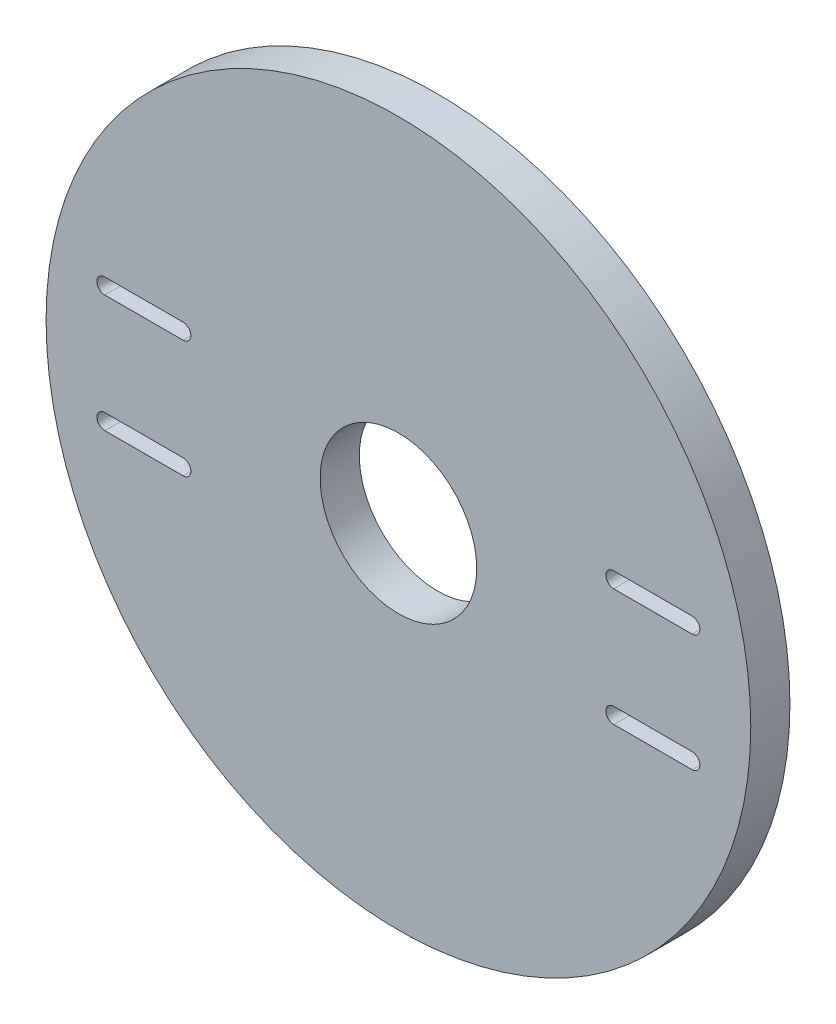
ISO-10303-21;
HEADER;
FILE_DESCRIPTION(('STEP AP214'),'2;1');
FILE_NAME('part.step','',(''),(''),'','','');
FILE_SCHEMA(('AUTOMOTIVE_DESIGN { 1 0 10303 214 1 1 1 1 }'));
ENDSEC;
DATA;
#1=APPLICATION_CONTEXT('core data for automotive mechanical design processes');
#2=APPLICATION_PROTOCOL_DEFINITION('international standard','automotive_design',2000,#1);
#3=PRODUCT_CONTEXT('',#1,'mechanical');
#4=PRODUCT('Part','Part','',(#3));
#5=PRODUCT_RELATED_PRODUCT_CATEGORY('part','',(#4));
#6=PRODUCT_DEFINITION_FORMATION('','',#4);
#7=PRODUCT_DEFINITION_CONTEXT('part definition',#1,'design');
#8=PRODUCT_DEFINITION('design','',#6,#7);
#9=PRODUCT_DEFINITION_SHAPE('','',#8);
#10=(LENGTH_UNIT() NAMED_UNIT(*) SI_UNIT(.MILLI.,.METRE.));
#11=(NAMED_UNIT(*) PLANE_ANGLE_UNIT() SI_UNIT($,.RADIAN.));
#12=(NAMED_UNIT(*) SI_UNIT($,.STERADIAN.) SOLID_ANGLE_UNIT());
#13=UNCERTAINTY_MEASURE_WITH_UNIT(LENGTH_MEASURE(1.E-05),#10,'distance_accuracy_value','');
#14=(GEOMETRIC_REPRESENTATION_CONTEXT(3) GLOBAL_UNCERTAINTY_ASSIGNED_CONTEXT((#13)) GLOBAL_UNIT_ASSIGNED_CONTEXT((#10,
#11,#12)) REPRESENTATION_CONTEXT('',''));
#15=CARTESIAN_POINT('',(0.,0.,0.));
#16=DIRECTION('',(0.,0.,1.));
#17=DIRECTION('',(1.,0.,0.));
#18=AXIS2_PLACEMENT_3D('',#15,#16,#17);
#19=CARTESIAN_POINT('',(0.,0.,20.));
#20=DIRECTION('',(0.,0.,-1.));
#21=DIRECTION('',(-1.,0.,0.));
#22=AXIS2_PLACEMENT_3D('',#19,#20,#21);
#23=CYLINDRICAL_SURFACE('',#22,180.);
#24=CARTESIAN_POINT('',(0.,0.,20.));
#25=DIRECTION('',(0.,0.,1.));
#26=DIRECTION('',(1.,0.,0.));
#27=AXIS2_PLACEMENT_3D('',#24,#25,#26);
#28=CIRCLE('',#27,180.);
#29=CARTESIAN_POINT('',(180.,0.,20.));
#30=VERTEX_POINT('',#29);
#31=EDGE_CURVE('E11',#30,#30,#28,.T.);
#32=ORIENTED_EDGE('',*,*,#31,.F.);
#33=EDGE_LOOP('',(#32));
#34=FACE_BOUND('',#33,.T.);
#35=CARTESIAN_POINT('',(0.,0.,0.));
#36=DIRECTION('',(0.,0.,1.));
#37=DIRECTION('',(1.,0.,0.));
#38=AXIS2_PLACEMENT_3D('',#35,#36,#37);
#39=CIRCLE('',#38,180.);
#40=CARTESIAN_POINT('',(180.,0.,0.));
#41=VERTEX_POINT('',#40);
#42=EDGE_CURVE('E43',#41,#41,#39,.T.);
#43=ORIENTED_EDGE('',*,*,#42,.T.);
#44=EDGE_LOOP('',(#43));
#45=FACE_BOUND('',#44,.T.);
#46=ADVANCED_FACE('F35',(#34,#45),#23,.T.);
#47=CARTESIAN_POINT('',(0.,0.,20.));
#48=DIRECTION('',(0.,0.,1.));
#49=DIRECTION('',(1.,0.,0.));
#50=AXIS2_PLACEMENT_3D('',#47,#48,#49);
#51=PLANE('',#50);
#52=CARTESIAN_POINT('',(-110.,-30.,20.));
#53=DIRECTION('',(0.,0.,1.));
#54=DIRECTION('',(1.,0.,0.));
#55=AXIS2_PLACEMENT_3D('',#52,#53,#54);
#56=CIRCLE('',#55,3.99999999999998);
#57=CARTESIAN_POINT('',(-110.,-34.,20.));
#58=VERTEX_POINT('',#57);
#59=CARTESIAN_POINT('',(-110.,-26.,20.));
#60=VERTEX_POINT('',#59);
#61=EDGE_CURVE('E51',#58,#60,#56,.T.);
#62=ORIENTED_EDGE('',*,*,#61,.F.);
#63=DIRECTION('',(1.,0.,0.));
#64=VECTOR('',#63,1.);
#65=CARTESIAN_POINT('',(-110.,-34.,20.));
#66=LINE('',#65,#64);
#67=CARTESIAN_POINT('',(-150.,-34.,20.));
#68=VERTEX_POINT('',#67);
#69=EDGE_CURVE('E157',#68,#58,#66,.T.);
#70=ORIENTED_EDGE('',*,*,#69,.F.);
#71=CARTESIAN_POINT('',(-150.,-30.,20.));
#72=DIRECTION('',(0.,0.,1.));
#73=DIRECTION('',(1.,0.,0.));
#74=AXIS2_PLACEMENT_3D('',#71,#72,#73);
#75=CIRCLE('',#74,4.);
#76=CARTESIAN_POINT('',(-150.,-26.,20.));
#77=VERTEX_POINT('',#76);
#78=EDGE_CURVE('E180',#77,#68,#75,.T.);
#79=ORIENTED_EDGE('',*,*,#78,.F.);
#80=DIRECTION('',(-1.,0.,0.));
#81=VECTOR('',#80,1.);
#82=CARTESIAN_POINT('',(-110.,-26.,20.));
#83=LINE('',#82,#81);
#84=EDGE_CURVE('E173',#60,#77,#83,.T.);
#85=ORIENTED_EDGE('',*,*,#84,.F.);
#86=EDGE_LOOP('',(#62,#70,#79,#85));
#87=FACE_BOUND('',#86,.T.);
#88=CARTESIAN_POINT('',(110.,30.,20.));
#89=DIRECTION('',(0.,0.,1.));
#90=DIRECTION('',(1.,0.,0.));
#91=AXIS2_PLACEMENT_3D('',#88,#89,#90);
#92=CIRCLE('',#91,3.99999999999997);
#93=CARTESIAN_POINT('',(110.,34.,20.));
#94=VERTEX_POINT('',#93);
#95=CARTESIAN_POINT('',(110.,26.,20.));
#96=VERTEX_POINT('',#95);
#97=EDGE_CURVE('E59',#94,#96,#92,.T.);
#98=ORIENTED_EDGE('',*,*,#97,.F.);
#99=DIRECTION('',(-1.,0.,0.));
#100=VECTOR('',#99,1.);
#101=CARTESIAN_POINT('',(110.,34.,20.));
#102=LINE('',#101,#100);
#103=CARTESIAN_POINT('',(150.,34.,20.));
#104=VERTEX_POINT('',#103);
#105=EDGE_CURVE('E205',#104,#94,#102,.T.);
#106=ORIENTED_EDGE('',*,*,#105,.F.);
#107=CARTESIAN_POINT('',(150.,30.,20.));
#108=DIRECTION('',(0.,0.,1.));
#109=DIRECTION('',(1.,0.,0.));
#110=AXIS2_PLACEMENT_3D('',#107,#108,#109);
#111=CIRCLE('',#110,3.99999999999999);
#112=CARTESIAN_POINT('',(150.,26.,20.));
#113=VERTEX_POINT('',#112);
#114=EDGE_CURVE('E202',#113,#104,#111,.T.);
#115=ORIENTED_EDGE('',*,*,#114,.F.);
#116=DIRECTION('',(1.,0.,0.));
#117=VECTOR('',#116,1.);
#118=CARTESIAN_POINT('',(110.,26.,20.));
#119=LINE('',#118,#117);
#120=EDGE_CURVE('E199',#96,#113,#119,.T.);
#121=ORIENTED_EDGE('',*,*,#120,.F.);
#122=EDGE_LOOP('',(#98,#106,#115,#121));
#123=FACE_BOUND('',#122,.T.);
#124=CARTESIAN_POINT('',(110.,-30.,20.));
#125=DIRECTION('',(0.,0.,1.));
#126=DIRECTION('',(-1.,0.,0.));
#127=AXIS2_PLACEMENT_3D('',#124,#125,#126);
#128=CIRCLE('',#127,3.99999999999997);
#129=CARTESIAN_POINT('',(110.,-26.,20.));
#130=VERTEX_POINT('',#129);
#131=CARTESIAN_POINT('',(110.,-34.,20.));
#132=VERTEX_POINT('',#131);
#133=EDGE_CURVE('E227',#130,#132,#128,.T.);
#134=ORIENTED_EDGE('',*,*,#133,.F.);
#135=DIRECTION('',(-1.,0.,0.));
#136=VECTOR('',#135,1.);
#137=CARTESIAN_POINT('',(110.,-26.,20.));
#138=LINE('',#137,#136);
#139=CARTESIAN_POINT('',(150.,-26.,20.));
#140=VERTEX_POINT('',#139);
#141=EDGE_CURVE('E235',#140,#130,#138,.T.);
#142=ORIENTED_EDGE('',*,*,#141,.F.);
#143=CARTESIAN_POINT('',(150.,-30.,20.));
#144=DIRECTION('',(0.,0.,1.));
#145=DIRECTION('',(-1.,0.,0.));
#146=AXIS2_PLACEMENT_3D('',#143,#144,#145);
#147=CIRCLE('',#146,3.99999999999999);
#148=CARTESIAN_POINT('',(150.,-34.,20.));
#149=VERTEX_POINT('',#148);
#150=EDGE_CURVE('E232',#149,#140,#147,.T.);
#151=ORIENTED_EDGE('',*,*,#150,.F.);
#152=DIRECTION('',(1.,0.,0.));
#153=VECTOR('',#152,1.);
#154=CARTESIAN_POINT('',(110.,-34.,20.));
#155=LINE('',#154,#153);
#156=EDGE_CURVE('E229',#132,#149,#155,.T.);
#157=ORIENTED_EDGE('',*,*,#156,.F.);
#158=EDGE_LOOP('',(#134,#142,#151,#157));
#159=FACE_BOUND('',#158,.T.);
#160=CARTESIAN_POINT('',(-110.,30.,20.));
#161=DIRECTION('',(0.,0.,1.));
#162=DIRECTION('',(-1.,0.,0.));
#163=AXIS2_PLACEMENT_3D('',#160,#161,#162);
#164=CIRCLE('',#163,3.99999999999998);
#165=CARTESIAN_POINT('',(-110.,26.,20.));
#166=VERTEX_POINT('',#165);
#167=CARTESIAN_POINT('',(-110.,34.,20.));
#168=VERTEX_POINT('',#167);
#169=EDGE_CURVE('E256',#166,#168,#164,.T.);
#170=ORIENTED_EDGE('',*,*,#169,.F.);
#171=DIRECTION('',(1.,0.,0.));
#172=VECTOR('',#171,1.);
#173=CARTESIAN_POINT('',(-110.,26.,20.));
#174=LINE('',#173,#172);
#175=CARTESIAN_POINT('',(-150.,26.,20.));
#176=VERTEX_POINT('',#175);
#177=EDGE_CURVE('E264',#176,#166,#174,.T.);
#178=ORIENTED_EDGE('',*,*,#177,.F.);
#179=CARTESIAN_POINT('',(-150.,30.,20.));
#180=DIRECTION('',(0.,0.,1.));
#181=DIRECTION('',(-1.,0.,0.));
#182=AXIS2_PLACEMENT_3D('',#179,#180,#181);
#183=CIRCLE('',#182,4.);
#184=CARTESIAN_POINT('',(-150.,34.,20.));
#185=VERTEX_POINT('',#184);
#186=EDGE_CURVE('E261',#185,#176,#183,.T.);
#187=ORIENTED_EDGE('',*,*,#186,.F.);
#188=DIRECTION('',(-1.,0.,0.));
#189=VECTOR('',#188,1.);
#190=CARTESIAN_POINT('',(-110.,34.,20.));
#191=LINE('',#190,#189);
#192=EDGE_CURVE('E258',#168,#185,#191,.T.);
#193=ORIENTED_EDGE('',*,*,#192,.F.);
#194=EDGE_LOOP('',(#170,#178,#187,#193));
#195=FACE_BOUND('',#194,.T.);
#196=CARTESIAN_POINT('',(0.,0.,20.));
#197=DIRECTION('',(0.,0.,1.));
#198=DIRECTION('',(1.,0.,0.));
#199=AXIS2_PLACEMENT_3D('',#196,#197,#198);
#200=CIRCLE('',#199,40.);
#201=CARTESIAN_POINT('',(40.,0.,20.));
#202=VERTEX_POINT('',#201);
#203=EDGE_CURVE('E279',#202,#202,#200,.T.);
#204=ORIENTED_EDGE('',*,*,#203,.F.);
#205=EDGE_LOOP('',(#204));
#206=FACE_BOUND('',#205,.T.);
#207=ORIENTED_EDGE('',*,*,#31,.T.);
#208=EDGE_LOOP('',(#207));
#209=FACE_BOUND('',#208,.T.);
#210=ADVANCED_FACE('F301',(#87,#123,#159,#195,#206,#209),#51,.T.);
#211=CARTESIAN_POINT('',(0.,0.,0.));
#212=DIRECTION('',(0.,0.,1.));
#213=DIRECTION('',(1.,0.,0.));
#214=AXIS2_PLACEMENT_3D('',#211,#212,#213);
#215=PLANE('',#214);
#216=DIRECTION('',(-1.,0.,0.));
#217=VECTOR('',#216,1.);
#218=CARTESIAN_POINT('',(-110.,-34.,0.));
#219=LINE('',#218,#217);
#220=CARTESIAN_POINT('',(-110.,-34.,0.));
#221=VERTEX_POINT('',#220);
#222=CARTESIAN_POINT('',(-150.,-34.,0.));
#223=VERTEX_POINT('',#222);
#224=EDGE_CURVE('E171',#221,#223,#219,.T.);
#225=ORIENTED_EDGE('',*,*,#224,.F.);
#226=CARTESIAN_POINT('',(-110.,-30.,0.));
#227=DIRECTION('',(0.,0.,1.));
#228=DIRECTION('',(1.,0.,0.));
#229=AXIS2_PLACEMENT_3D('',#226,#227,#228);
#230=CIRCLE('',#229,3.99999999999998);
#231=CARTESIAN_POINT('',(-110.,-26.,0.));
#232=VERTEX_POINT('',#231);
#233=EDGE_CURVE('E151',#232,#221,#230,.F.);
#234=ORIENTED_EDGE('',*,*,#233,.F.);
#235=DIRECTION('',(1.,0.,0.));
#236=VECTOR('',#235,1.);
#237=CARTESIAN_POINT('',(-110.,-26.,0.));
#238=LINE('',#237,#236);
#239=CARTESIAN_POINT('',(-150.,-26.,0.));
#240=VERTEX_POINT('',#239);
#241=EDGE_CURVE('E161',#240,#232,#238,.T.);
#242=ORIENTED_EDGE('',*,*,#241,.F.);
#243=CARTESIAN_POINT('',(-150.,-30.,0.));
#244=DIRECTION('',(0.,0.,1.));
#245=DIRECTION('',(1.,0.,0.));
#246=AXIS2_PLACEMENT_3D('',#243,#244,#245);
#247=CIRCLE('',#246,4.);
#248=EDGE_CURVE('E175',#223,#240,#247,.F.);
#249=ORIENTED_EDGE('',*,*,#248,.F.);
#250=EDGE_LOOP('',(#225,#234,#242,#249));
#251=FACE_BOUND('',#250,.T.);
#252=DIRECTION('',(1.,0.,0.));
#253=VECTOR('',#252,1.);
#254=CARTESIAN_POINT('',(110.,34.,0.));
#255=LINE('',#254,#253);
#256=CARTESIAN_POINT('',(110.,34.,0.));
#257=VERTEX_POINT('',#256);
#258=CARTESIAN_POINT('',(150.,34.,0.));
#259=VERTEX_POINT('',#258);
#260=EDGE_CURVE('E191',#257,#259,#255,.T.);
#261=ORIENTED_EDGE('',*,*,#260,.F.);
#262=CARTESIAN_POINT('',(110.,30.,0.));
#263=DIRECTION('',(0.,0.,1.));
#264=DIRECTION('',(1.,0.,0.));
#265=AXIS2_PLACEMENT_3D('',#262,#263,#264);
#266=CIRCLE('',#265,3.99999999999997);
#267=CARTESIAN_POINT('',(110.,26.,0.));
#268=VERTEX_POINT('',#267);
#269=EDGE_CURVE('E195',#268,#257,#266,.F.);
#270=ORIENTED_EDGE('',*,*,#269,.F.);
#271=DIRECTION('',(-1.,0.,0.));
#272=VECTOR('',#271,1.);
#273=CARTESIAN_POINT('',(110.,26.,0.));
#274=LINE('',#273,#272);
#275=CARTESIAN_POINT('',(150.,26.,0.));
#276=VERTEX_POINT('',#275);
#277=EDGE_CURVE('E211',#276,#268,#274,.T.);
#278=ORIENTED_EDGE('',*,*,#277,.F.);
#279=CARTESIAN_POINT('',(150.,30.,0.));
#280=DIRECTION('',(0.,0.,1.));
#281=DIRECTION('',(1.,0.,0.));
#282=AXIS2_PLACEMENT_3D('',#279,#280,#281);
#283=CIRCLE('',#282,3.99999999999999);
#284=EDGE_CURVE('E189',#259,#276,#283,.F.);
#285=ORIENTED_EDGE('',*,*,#284,.F.);
#286=EDGE_LOOP('',(#261,#270,#278,#285));
#287=FACE_BOUND('',#286,.T.);
#288=DIRECTION('',(1.,0.,0.));
#289=VECTOR('',#288,1.);
#290=CARTESIAN_POINT('',(110.,-26.,0.));
#291=LINE('',#290,#289);
#292=CARTESIAN_POINT('',(110.,-26.,0.));
#293=VERTEX_POINT('',#292);
#294=CARTESIAN_POINT('',(150.,-26.,0.));
#295=VERTEX_POINT('',#294);
#296=EDGE_CURVE('E221',#293,#295,#291,.T.);
#297=ORIENTED_EDGE('',*,*,#296,.F.);
#298=CARTESIAN_POINT('',(110.,-30.,0.));
#299=DIRECTION('',(0.,0.,1.));
#300=DIRECTION('',(1.,0.,0.));
#301=AXIS2_PLACEMENT_3D('',#298,#299,#300);
#302=CIRCLE('',#301,3.99999999999997);
#303=CARTESIAN_POINT('',(110.,-34.,0.));
#304=VERTEX_POINT('',#303);
#305=EDGE_CURVE('E224',#304,#293,#302,.F.);
#306=ORIENTED_EDGE('',*,*,#305,.F.);
#307=DIRECTION('',(-1.,0.,0.));
#308=VECTOR('',#307,1.);
#309=CARTESIAN_POINT('',(110.,-34.,0.));
#310=LINE('',#309,#308);
#311=CARTESIAN_POINT('',(150.,-34.,0.));
#312=VERTEX_POINT('',#311);
#313=EDGE_CURVE('E192',#312,#304,#310,.T.);
#314=ORIENTED_EDGE('',*,*,#313,.F.);
#315=CARTESIAN_POINT('',(150.,-30.,0.));
#316=DIRECTION('',(0.,0.,1.));
#317=DIRECTION('',(1.,0.,0.));
#318=AXIS2_PLACEMENT_3D('',#315,#316,#317);
#319=CIRCLE('',#318,3.99999999999999);
#320=EDGE_CURVE('E219',#295,#312,#319,.F.);
#321=ORIENTED_EDGE('',*,*,#320,.F.);
#322=EDGE_LOOP('',(#297,#306,#314,#321));
#323=FACE_BOUND('',#322,.T.);
#324=DIRECTION('',(-1.,0.,0.));
#325=VECTOR('',#324,1.);
#326=CARTESIAN_POINT('',(-110.,26.,0.));
#327=LINE('',#326,#325);
#328=CARTESIAN_POINT('',(-110.,26.,0.));
#329=VERTEX_POINT('',#328);
#330=CARTESIAN_POINT('',(-150.,26.,0.));
#331=VERTEX_POINT('',#330);
#332=EDGE_CURVE('E250',#329,#331,#327,.T.);
#333=ORIENTED_EDGE('',*,*,#332,.F.);
#334=CARTESIAN_POINT('',(-110.,30.,0.));
#335=DIRECTION('',(0.,0.,1.));
#336=DIRECTION('',(1.,0.,0.));
#337=AXIS2_PLACEMENT_3D('',#334,#335,#336);
#338=CIRCLE('',#337,3.99999999999998);
#339=CARTESIAN_POINT('',(-110.,34.,0.));
#340=VERTEX_POINT('',#339);
#341=EDGE_CURVE('E253',#340,#329,#338,.F.);
#342=ORIENTED_EDGE('',*,*,#341,.F.);
#343=DIRECTION('',(1.,0.,0.));
#344=VECTOR('',#343,1.);
#345=CARTESIAN_POINT('',(-110.,34.,0.));
#346=LINE('',#345,#344);
#347=CARTESIAN_POINT('',(-150.,34.,0.));
#348=VERTEX_POINT('',#347);
#349=EDGE_CURVE('E270',#348,#340,#346,.T.);
#350=ORIENTED_EDGE('',*,*,#349,.F.);
#351=CARTESIAN_POINT('',(-150.,30.,0.));
#352=DIRECTION('',(0.,0.,1.));
#353=DIRECTION('',(1.,0.,0.));
#354=AXIS2_PLACEMENT_3D('',#351,#352,#353);
#355=CIRCLE('',#354,4.);
#356=EDGE_CURVE('E165',#331,#348,#355,.F.);
#357=ORIENTED_EDGE('',*,*,#356,.F.);
#358=EDGE_LOOP('',(#333,#342,#350,#357));
#359=FACE_BOUND('',#358,.T.);
#360=CARTESIAN_POINT('',(0.,0.,0.));
#361=DIRECTION('',(0.,0.,1.));
#362=DIRECTION('',(1.,0.,0.));
#363=AXIS2_PLACEMENT_3D('',#360,#361,#362);
#364=CIRCLE('',#363,40.);
#365=CARTESIAN_POINT('',(40.,0.,0.));
#366=VERTEX_POINT('',#365);
#367=EDGE_CURVE('E38',#366,#366,#364,.T.);
#368=ORIENTED_EDGE('',*,*,#367,.T.);
#369=EDGE_LOOP('',(#368));
#370=FACE_BOUND('',#369,.T.);
#371=ORIENTED_EDGE('',*,*,#42,.F.);
#372=EDGE_LOOP('',(#371));
#373=FACE_BOUND('',#372,.T.);
#374=ADVANCED_FACE('F168',(#251,#287,#323,#359,#370,#373),#215,.F.);
#375=CARTESIAN_POINT('',(0.,0.,-234.));
#376=DIRECTION('',(0.,0.,1.));
#377=DIRECTION('',(1.,0.,0.));
#378=AXIS2_PLACEMENT_3D('',#375,#376,#377);
#379=CYLINDRICAL_SURFACE('',#378,40.);
#380=ORIENTED_EDGE('',*,*,#203,.T.);
#381=EDGE_LOOP('',(#380));
#382=FACE_BOUND('',#381,.T.);
#383=ORIENTED_EDGE('',*,*,#367,.F.);
#384=EDGE_LOOP('',(#383));
#385=FACE_BOUND('',#384,.T.);
#386=ADVANCED_FACE('F289',(#382,#385),#379,.F.);
#387=CARTESIAN_POINT('',(-110.,30.,-0.001000000000001));
#388=DIRECTION('',(0.,0.,1.));
#389=DIRECTION('',(1.,0.,0.));
#390=AXIS2_PLACEMENT_3D('',#387,#388,#389);
#391=CYLINDRICAL_SURFACE('',#390,3.99999999999998);
#392=ORIENTED_EDGE('',*,*,#341,.T.);
#393=DIRECTION('',(0.,0.,1.));
#394=VECTOR('',#393,1.);
#395=CARTESIAN_POINT('',(-110.,26.,-0.001000000000001));
#396=LINE('',#395,#394);
#397=EDGE_CURVE('E268',#329,#166,#396,.T.);
#398=ORIENTED_EDGE('',*,*,#397,.T.);
#399=ORIENTED_EDGE('',*,*,#169,.T.);
#400=DIRECTION('',(0.,0.,1.));
#401=VECTOR('',#400,1.);
#402=CARTESIAN_POINT('',(-110.,34.,-0.001000000000001));
#403=LINE('',#402,#401);
#404=EDGE_CURVE('E267',#340,#168,#403,.T.);
#405=ORIENTED_EDGE('',*,*,#404,.F.);
#406=EDGE_LOOP('',(#392,#398,#399,#405));
#407=FACE_BOUND('',#406,.T.);
#408=ADVANCED_FACE('F291',(#407),#391,.F.);
#409=CARTESIAN_POINT('',(-110.,26.,-0.001000000000001));
#410=DIRECTION('',(0.,-1.,0.));
#411=DIRECTION('',(1.,0.,0.));
#412=AXIS2_PLACEMENT_3D('',#409,#410,#411);
#413=PLANE('',#412);
#414=ORIENTED_EDGE('',*,*,#332,.T.);
#415=DIRECTION('',(0.,0.,1.));
#416=VECTOR('',#415,1.);
#417=CARTESIAN_POINT('',(-150.,26.,-0.001000000000001));
#418=LINE('',#417,#416);
#419=EDGE_CURVE('E271',#331,#176,#418,.T.);
#420=ORIENTED_EDGE('',*,*,#419,.T.);
#421=ORIENTED_EDGE('',*,*,#177,.T.);
#422=ORIENTED_EDGE('',*,*,#397,.F.);
#423=EDGE_LOOP('',(#414,#420,#421,#422));
#424=FACE_BOUND('',#423,.T.);
#425=ADVANCED_FACE('F298',(#424),#413,.F.);
#426=CARTESIAN_POINT('',(-150.,30.,-0.001000000000001));
#427=DIRECTION('',(0.,0.,1.));
#428=DIRECTION('',(1.,0.,0.));
#429=AXIS2_PLACEMENT_3D('',#426,#427,#428);
#430=CYLINDRICAL_SURFACE('',#429,4.);
#431=ORIENTED_EDGE('',*,*,#356,.T.);
#432=DIRECTION('',(0.,0.,1.));
#433=VECTOR('',#432,1.);
#434=CARTESIAN_POINT('',(-150.,34.,-0.001000000000001));
#435=LINE('',#434,#433);
#436=EDGE_CURVE('E273',#348,#185,#435,.T.);
#437=ORIENTED_EDGE('',*,*,#436,.T.);
#438=ORIENTED_EDGE('',*,*,#186,.T.);
#439=ORIENTED_EDGE('',*,*,#419,.F.);
#440=EDGE_LOOP('',(#431,#437,#438,#439));
#441=FACE_BOUND('',#440,.T.);
#442=ADVANCED_FACE('F338',(#441),#430,.F.);
#443=CARTESIAN_POINT('',(-110.,34.,-0.001000000000001));
#444=DIRECTION('',(0.,1.,0.));
#445=DIRECTION('',(-1.,0.,0.));
#446=AXIS2_PLACEMENT_3D('',#443,#444,#445);
#447=PLANE('',#446);
#448=ORIENTED_EDGE('',*,*,#349,.T.);
#449=ORIENTED_EDGE('',*,*,#404,.T.);
#450=ORIENTED_EDGE('',*,*,#192,.T.);
#451=ORIENTED_EDGE('',*,*,#436,.F.);
#452=EDGE_LOOP('',(#448,#449,#450,#451));
#453=FACE_BOUND('',#452,.T.);
#454=ADVANCED_FACE('F329',(#453),#447,.F.);
#455=CARTESIAN_POINT('',(110.,-30.,-0.001000000000001));
#456=DIRECTION('',(0.,0.,1.));
#457=DIRECTION('',(1.,0.,0.));
#458=AXIS2_PLACEMENT_3D('',#455,#456,#457);
#459=CYLINDRICAL_SURFACE('',#458,3.99999999999997);
#460=ORIENTED_EDGE('',*,*,#305,.T.);
#461=DIRECTION('',(0.,0.,1.));
#462=VECTOR('',#461,1.);
#463=CARTESIAN_POINT('',(110.,-26.,-0.001000000000001));
#464=LINE('',#463,#462);
#465=EDGE_CURVE('E239',#293,#130,#464,.T.);
#466=ORIENTED_EDGE('',*,*,#465,.T.);
#467=ORIENTED_EDGE('',*,*,#133,.T.);
#468=DIRECTION('',(0.,0.,1.));
#469=VECTOR('',#468,1.);
#470=CARTESIAN_POINT('',(110.,-34.,-0.001000000000001));
#471=LINE('',#470,#469);
#472=EDGE_CURVE('E238',#304,#132,#471,.T.);
#473=ORIENTED_EDGE('',*,*,#472,.F.);
#474=EDGE_LOOP('',(#460,#466,#467,#473));
#475=FACE_BOUND('',#474,.T.);
#476=ADVANCED_FACE('F345',(#475),#459,.F.);
#477=CARTESIAN_POINT('',(110.,-26.,-0.001000000000001));
#478=DIRECTION('',(0.,1.,0.));
#479=DIRECTION('',(-1.,0.,0.));
#480=AXIS2_PLACEMENT_3D('',#477,#478,#479);
#481=PLANE('',#480);
#482=ORIENTED_EDGE('',*,*,#296,.T.);
#483=DIRECTION('',(0.,0.,1.));
#484=VECTOR('',#483,1.);
#485=CARTESIAN_POINT('',(150.,-26.,-0.001000000000001));
#486=LINE('',#485,#484);
#487=EDGE_CURVE('E241',#295,#140,#486,.T.);
#488=ORIENTED_EDGE('',*,*,#487,.T.);
#489=ORIENTED_EDGE('',*,*,#141,.T.);
#490=ORIENTED_EDGE('',*,*,#465,.F.);
#491=EDGE_LOOP('',(#482,#488,#489,#490));
#492=FACE_BOUND('',#491,.T.);
#493=ADVANCED_FACE('F351',(#492),#481,.F.);
#494=CARTESIAN_POINT('',(150.,-30.,-0.001000000000001));
#495=DIRECTION('',(0.,0.,1.));
#496=DIRECTION('',(1.,0.,0.));
#497=AXIS2_PLACEMENT_3D('',#494,#495,#496);
#498=CYLINDRICAL_SURFACE('',#497,3.99999999999999);
#499=ORIENTED_EDGE('',*,*,#320,.T.);
#500=DIRECTION('',(0.,0.,1.));
#501=VECTOR('',#500,1.);
#502=CARTESIAN_POINT('',(150.,-34.,-0.001000000000001));
#503=LINE('',#502,#501);
#504=EDGE_CURVE('E243',#312,#149,#503,.T.);
#505=ORIENTED_EDGE('',*,*,#504,.T.);
#506=ORIENTED_EDGE('',*,*,#150,.T.);
#507=ORIENTED_EDGE('',*,*,#487,.F.);
#508=EDGE_LOOP('',(#499,#505,#506,#507));
#509=FACE_BOUND('',#508,.T.);
#510=ADVANCED_FACE('F357',(#509),#498,.F.);
#511=CARTESIAN_POINT('',(110.,-34.,-0.001000000000001));
#512=DIRECTION('',(0.,-1.,0.));
#513=DIRECTION('',(1.,0.,0.));
#514=AXIS2_PLACEMENT_3D('',#511,#512,#513);
#515=PLANE('',#514);
#516=ORIENTED_EDGE('',*,*,#313,.T.);
#517=ORIENTED_EDGE('',*,*,#472,.T.);
#518=ORIENTED_EDGE('',*,*,#156,.T.);
#519=ORIENTED_EDGE('',*,*,#504,.F.);
#520=EDGE_LOOP('',(#516,#517,#518,#519));
#521=FACE_BOUND('',#520,.T.);
#522=ADVANCED_FACE('F353',(#521),#515,.F.);
#523=CARTESIAN_POINT('',(110.,30.,-0.001000000000001));
#524=DIRECTION('',(0.,0.,1.));
#525=DIRECTION('',(1.,0.,0.));
#526=AXIS2_PLACEMENT_3D('',#523,#524,#525);
#527=CYLINDRICAL_SURFACE('',#526,3.99999999999997);
#528=ORIENTED_EDGE('',*,*,#269,.T.);
#529=DIRECTION('',(0.,0.,1.));
#530=VECTOR('',#529,1.);
#531=CARTESIAN_POINT('',(110.,34.,-0.001000000000001));
#532=LINE('',#531,#530);
#533=EDGE_CURVE('E209',#257,#94,#532,.T.);
#534=ORIENTED_EDGE('',*,*,#533,.T.);
#535=ORIENTED_EDGE('',*,*,#97,.T.);
#536=DIRECTION('',(0.,0.,1.));
#537=VECTOR('',#536,1.);
#538=CARTESIAN_POINT('',(110.,26.,-0.001000000000001));
#539=LINE('',#538,#537);
#540=EDGE_CURVE('E208',#268,#96,#539,.T.);
#541=ORIENTED_EDGE('',*,*,#540,.F.);
#542=EDGE_LOOP('',(#528,#534,#535,#541));
#543=FACE_BOUND('',#542,.T.);
#544=ADVANCED_FACE('F356',(#543),#527,.F.);
#545=CARTESIAN_POINT('',(110.,34.,-0.001000000000001));
#546=DIRECTION('',(0.,1.,0.));
#547=DIRECTION('',(-1.,0.,0.));
#548=AXIS2_PLACEMENT_3D('',#545,#546,#547);
#549=PLANE('',#548);
#550=ORIENTED_EDGE('',*,*,#260,.T.);
#551=DIRECTION('',(0.,0.,1.));
#552=VECTOR('',#551,1.);
#553=CARTESIAN_POINT('',(150.,34.,-0.001000000000001));
#554=LINE('',#553,#552);
#555=EDGE_CURVE('E212',#259,#104,#554,.T.);
#556=ORIENTED_EDGE('',*,*,#555,.T.);
#557=ORIENTED_EDGE('',*,*,#105,.T.);
#558=ORIENTED_EDGE('',*,*,#533,.F.);
#559=EDGE_LOOP('',(#550,#556,#557,#558));
#560=FACE_BOUND('',#559,.T.);
#561=ADVANCED_FACE('F367',(#560),#549,.F.);
#562=CARTESIAN_POINT('',(150.,30.,-0.001000000000001));
#563=DIRECTION('',(0.,0.,1.));
#564=DIRECTION('',(1.,0.,0.));
#565=AXIS2_PLACEMENT_3D('',#562,#563,#564);
#566=CYLINDRICAL_SURFACE('',#565,3.99999999999999);
#567=ORIENTED_EDGE('',*,*,#284,.T.);
#568=DIRECTION('',(0.,0.,1.));
#569=VECTOR('',#568,1.);
#570=CARTESIAN_POINT('',(150.,26.,-0.001000000000001));
#571=LINE('',#570,#569);
#572=EDGE_CURVE('E214',#276,#113,#571,.T.);
#573=ORIENTED_EDGE('',*,*,#572,.T.);
#574=ORIENTED_EDGE('',*,*,#114,.T.);
#575=ORIENTED_EDGE('',*,*,#555,.F.);
#576=EDGE_LOOP('',(#567,#573,#574,#575));
#577=FACE_BOUND('',#576,.T.);
#578=ADVANCED_FACE('F371',(#577),#566,.F.);
#579=CARTESIAN_POINT('',(110.,26.,-0.001000000000001));
#580=DIRECTION('',(0.,-1.,0.));
#581=DIRECTION('',(1.,0.,0.));
#582=AXIS2_PLACEMENT_3D('',#579,#580,#581);
#583=PLANE('',#582);
#584=ORIENTED_EDGE('',*,*,#277,.T.);
#585=ORIENTED_EDGE('',*,*,#540,.T.);
#586=ORIENTED_EDGE('',*,*,#120,.T.);
#587=ORIENTED_EDGE('',*,*,#572,.F.);
#588=EDGE_LOOP('',(#584,#585,#586,#587));
#589=FACE_BOUND('',#588,.T.);
#590=ADVANCED_FACE('F368',(#589),#583,.F.);
#591=CARTESIAN_POINT('',(-110.,-30.,-0.001000000000001));
#592=DIRECTION('',(0.,0.,1.));
#593=DIRECTION('',(1.,0.,0.));
#594=AXIS2_PLACEMENT_3D('',#591,#592,#593);
#595=CYLINDRICAL_SURFACE('',#594,3.99999999999998);
#596=ORIENTED_EDGE('',*,*,#233,.T.);
#597=DIRECTION('',(0.,0.,1.));
#598=VECTOR('',#597,1.);
#599=CARTESIAN_POINT('',(-110.,-34.,-0.001000000000001));
#600=LINE('',#599,#598);
#601=EDGE_CURVE('E166',#221,#58,#600,.T.);
#602=ORIENTED_EDGE('',*,*,#601,.T.);
#603=ORIENTED_EDGE('',*,*,#61,.T.);
#604=DIRECTION('',(0.,0.,1.));
#605=VECTOR('',#604,1.);
#606=CARTESIAN_POINT('',(-110.,-26.,-0.001000000000001));
#607=LINE('',#606,#605);
#608=EDGE_CURVE('E147',#232,#60,#607,.T.);
#609=ORIENTED_EDGE('',*,*,#608,.F.);
#610=EDGE_LOOP('',(#596,#602,#603,#609));
#611=FACE_BOUND('',#610,.T.);
#612=ADVANCED_FACE('F149',(#611),#595,.F.);
#613=CARTESIAN_POINT('',(-110.,-34.,-0.001000000000001));
#614=DIRECTION('',(0.,-1.,0.));
#615=DIRECTION('',(1.,0.,0.));
#616=AXIS2_PLACEMENT_3D('',#613,#614,#615);
#617=PLANE('',#616);
#618=ORIENTED_EDGE('',*,*,#224,.T.);
#619=DIRECTION('',(0.,0.,1.));
#620=VECTOR('',#619,1.);
#621=CARTESIAN_POINT('',(-150.,-34.,-0.001000000000001));
#622=LINE('',#621,#620);
#623=EDGE_CURVE('E186',#223,#68,#622,.T.);
#624=ORIENTED_EDGE('',*,*,#623,.T.);
#625=ORIENTED_EDGE('',*,*,#69,.T.);
#626=ORIENTED_EDGE('',*,*,#601,.F.);
#627=EDGE_LOOP('',(#618,#624,#625,#626));
#628=FACE_BOUND('',#627,.T.);
#629=ADVANCED_FACE('F381',(#628),#617,.F.);
#630=CARTESIAN_POINT('',(-150.,-30.,-0.001000000000001));
#631=DIRECTION('',(0.,0.,1.));
#632=DIRECTION('',(1.,0.,0.));
#633=AXIS2_PLACEMENT_3D('',#630,#631,#632);
#634=CYLINDRICAL_SURFACE('',#633,4.);
#635=ORIENTED_EDGE('',*,*,#248,.T.);
#636=DIRECTION('',(0.,0.,1.));
#637=VECTOR('',#636,1.);
#638=CARTESIAN_POINT('',(-150.,-26.,-0.001000000000001));
#639=LINE('',#638,#637);
#640=EDGE_CURVE('E156',#240,#77,#639,.T.);
#641=ORIENTED_EDGE('',*,*,#640,.T.);
#642=ORIENTED_EDGE('',*,*,#78,.T.);
#643=ORIENTED_EDGE('',*,*,#623,.F.);
#644=EDGE_LOOP('',(#635,#641,#642,#643));
#645=FACE_BOUND('',#644,.T.);
#646=ADVANCED_FACE('F384',(#645),#634,.F.);
#647=CARTESIAN_POINT('',(-110.,-26.,-0.001000000000001));
#648=DIRECTION('',(0.,1.,0.));
#649=DIRECTION('',(-1.,0.,0.));
#650=AXIS2_PLACEMENT_3D('',#647,#648,#649);
#651=PLANE('',#650);
#652=ORIENTED_EDGE('',*,*,#241,.T.);
#653=ORIENTED_EDGE('',*,*,#608,.T.);
#654=ORIENTED_EDGE('',*,*,#84,.T.);
#655=ORIENTED_EDGE('',*,*,#640,.F.);
#656=EDGE_LOOP('',(#652,#653,#654,#655));
#657=FACE_BOUND('',#656,.T.);
#658=ADVANCED_FACE('F162',(#657),#651,.F.);
#659=CLOSED_SHELL('',(#46,#210,#374,#386,#408,#425,#442,#454,#476,#493,#510,#522,#544,#561,#578,
#590,#612,#629,#646,#658));
#660=MANIFOLD_SOLID_BREP('B2',#659);
#661=ADVANCED_BREP_SHAPE_REPRESENTATION('',(#18,#660),#14);
#662=SHAPE_DEFINITION_REPRESENTATION(#9,#661);
ENDSEC;
END-ISO-10303-21;
